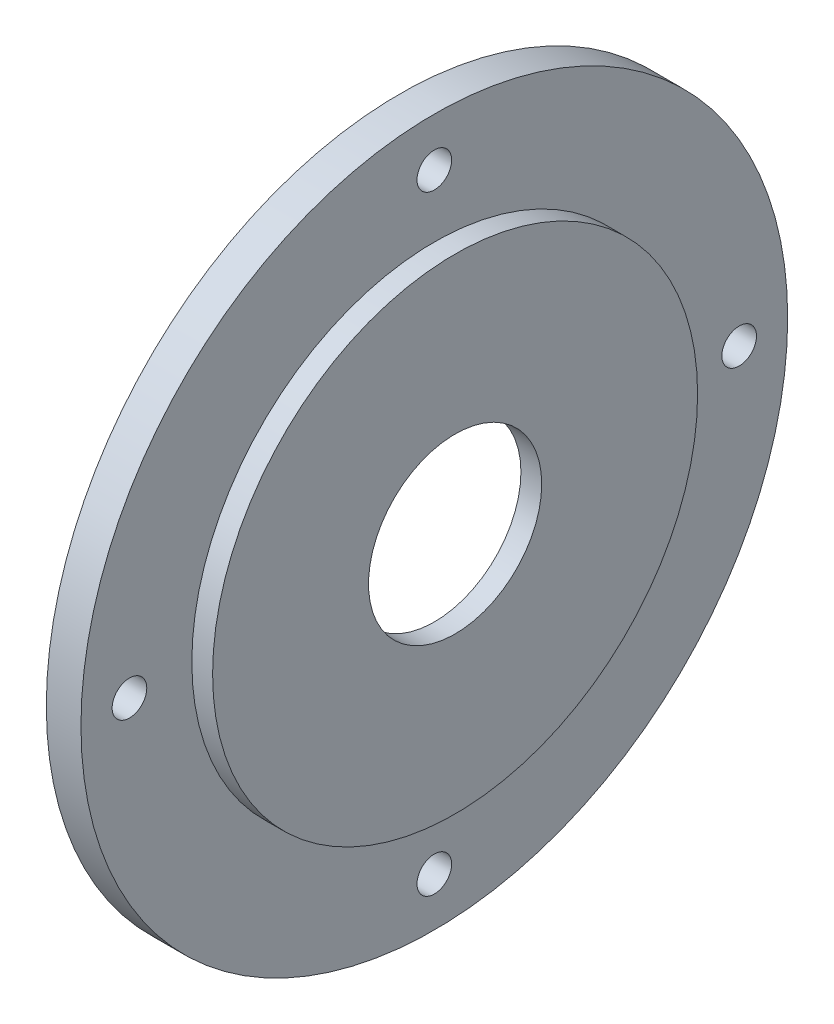
ISO-10303-21;
HEADER;
FILE_DESCRIPTION(('STEP AP214'),'2;1');
FILE_NAME('part.step','',(''),(''),'','','');
FILE_SCHEMA(('AUTOMOTIVE_DESIGN { 1 0 10303 214 1 1 1 1 }'));
ENDSEC;
DATA;
#1=APPLICATION_CONTEXT('core data for automotive mechanical design processes');
#2=APPLICATION_PROTOCOL_DEFINITION('international standard','automotive_design',2000,#1);
#3=PRODUCT_CONTEXT('',#1,'mechanical');
#4=PRODUCT('Part','Part','',(#3));
#5=PRODUCT_RELATED_PRODUCT_CATEGORY('part','',(#4));
#6=PRODUCT_DEFINITION_FORMATION('','',#4);
#7=PRODUCT_DEFINITION_CONTEXT('part definition',#1,'design');
#8=PRODUCT_DEFINITION('design','',#6,#7);
#9=PRODUCT_DEFINITION_SHAPE('','',#8);
#10=(LENGTH_UNIT() NAMED_UNIT(*) SI_UNIT(.MILLI.,.METRE.));
#11=(NAMED_UNIT(*) PLANE_ANGLE_UNIT() SI_UNIT($,.RADIAN.));
#12=(NAMED_UNIT(*) SI_UNIT($,.STERADIAN.) SOLID_ANGLE_UNIT());
#13=UNCERTAINTY_MEASURE_WITH_UNIT(LENGTH_MEASURE(1.E-05),#10,'distance_accuracy_value','');
#14=(GEOMETRIC_REPRESENTATION_CONTEXT(3) GLOBAL_UNCERTAINTY_ASSIGNED_CONTEXT((#13)) GLOBAL_UNIT_ASSIGNED_CONTEXT((#10,
#11,#12)) REPRESENTATION_CONTEXT('',''));
#15=CARTESIAN_POINT('',(0.,0.,0.));
#16=DIRECTION('',(0.,0.,1.));
#17=DIRECTION('',(1.,0.,0.));
#18=AXIS2_PLACEMENT_3D('',#15,#16,#17);
#19=CARTESIAN_POINT('',(5.,0.,0.));
#20=DIRECTION('',(1.,0.,0.));
#21=DIRECTION('',(0.,0.,-1.));
#22=AXIS2_PLACEMENT_3D('',#19,#20,#21);
#23=PLANE('',#22);
#24=CARTESIAN_POINT('',(5.,44.,0.));
#25=DIRECTION('',(1.,0.,0.));
#26=DIRECTION('',(0.,0.,-1.));
#27=AXIS2_PLACEMENT_3D('',#24,#25,#26);
#28=CIRCLE('',#27,2.5);
#29=CARTESIAN_POINT('',(5.,44.,-2.5));
#30=VERTEX_POINT('',#29);
#31=EDGE_CURVE('E90',#30,#30,#28,.T.);
#32=ORIENTED_EDGE('',*,*,#31,.F.);
#33=EDGE_LOOP('',(#32));
#34=FACE_BOUND('',#33,.T.);
#35=CARTESIAN_POINT('',(5.,1.2424725460634E-12,-44.0000000000012));
#36=DIRECTION('',(1.,0.,0.));
#37=DIRECTION('',(0.,0.,-1.));
#38=AXIS2_PLACEMENT_3D('',#35,#36,#37);
#39=CIRCLE('',#38,2.50000000000098);
#40=CARTESIAN_POINT('',(5.,1.2424725460634E-12,-46.5000000000022));
#41=VERTEX_POINT('',#40);
#42=EDGE_CURVE('E82',#41,#41,#39,.T.);
#43=ORIENTED_EDGE('',*,*,#42,.F.);
#44=EDGE_LOOP('',(#43));
#45=FACE_BOUND('',#44,.T.);
#46=CARTESIAN_POINT('',(5.,-44.,-2.48494509212681E-12));
#47=DIRECTION('',(1.,0.,0.));
#48=DIRECTION('',(0.,0.,-1.));
#49=AXIS2_PLACEMENT_3D('',#46,#47,#48);
#50=CIRCLE('',#49,2.50000000000267);
#51=CARTESIAN_POINT('',(5.,-44.,-2.50000000000516));
#52=VERTEX_POINT('',#51);
#53=EDGE_CURVE('E72',#52,#52,#50,.T.);
#54=ORIENTED_EDGE('',*,*,#53,.F.);
#55=EDGE_LOOP('',(#54));
#56=FACE_BOUND('',#55,.T.);
#57=CARTESIAN_POINT('',(5.,-1.24786099197965E-12,43.9999999999988));
#58=DIRECTION('',(1.,0.,0.));
#59=DIRECTION('',(0.,0.,-1.));
#60=AXIS2_PLACEMENT_3D('',#57,#58,#59);
#61=CIRCLE('',#60,2.500000000002);
#62=CARTESIAN_POINT('',(5.,-1.24786099197965E-12,41.4999999999968));
#63=VERTEX_POINT('',#62);
#64=EDGE_CURVE('E73',#63,#63,#61,.T.);
#65=ORIENTED_EDGE('',*,*,#64,.F.);
#66=EDGE_LOOP('',(#65));
#67=FACE_BOUND('',#66,.T.);
#68=CARTESIAN_POINT('',(5.,0.,0.));
#69=DIRECTION('',(1.,0.,0.));
#70=DIRECTION('',(0.,0.,-1.));
#71=AXIS2_PLACEMENT_3D('',#68,#69,#70);
#72=CIRCLE('',#71,35.);
#73=CARTESIAN_POINT('',(5.,0.,-35.));
#74=VERTEX_POINT('',#73);
#75=EDGE_CURVE('E60',#74,#74,#72,.T.);
#76=ORIENTED_EDGE('',*,*,#75,.F.);
#77=EDGE_LOOP('',(#76));
#78=FACE_BOUND('',#77,.T.);
#79=CARTESIAN_POINT('',(5.,0.,0.));
#80=DIRECTION('',(1.,0.,0.));
#81=DIRECTION('',(0.,0.,-1.));
#82=AXIS2_PLACEMENT_3D('',#79,#80,#81);
#83=CIRCLE('',#82,51.);
#84=CARTESIAN_POINT('',(5.,0.,-51.));
#85=VERTEX_POINT('',#84);
#86=EDGE_CURVE('E10',#85,#85,#83,.T.);
#87=ORIENTED_EDGE('',*,*,#86,.T.);
#88=EDGE_LOOP('',(#87));
#89=FACE_BOUND('',#88,.T.);
#90=ADVANCED_FACE('F37',(#34,#45,#56,#67,#78,#89),#23,.T.);
#91=CARTESIAN_POINT('',(0.,0.,0.));
#92=DIRECTION('',(1.,0.,0.));
#93=DIRECTION('',(0.,0.,-1.));
#94=AXIS2_PLACEMENT_3D('',#91,#92,#93);
#95=PLANE('',#94);
#96=CARTESIAN_POINT('',(0.,44.,0.));
#97=DIRECTION('',(1.,0.,0.));
#98=DIRECTION('',(0.,0.,-1.));
#99=AXIS2_PLACEMENT_3D('',#96,#97,#98);
#100=CIRCLE('',#99,2.5);
#101=CARTESIAN_POINT('',(0.,44.,-2.5));
#102=VERTEX_POINT('',#101);
#103=EDGE_CURVE('E64',#102,#102,#100,.F.);
#104=ORIENTED_EDGE('',*,*,#103,.F.);
#105=EDGE_LOOP('',(#104));
#106=FACE_BOUND('',#105,.T.);
#107=CARTESIAN_POINT('',(0.,1.2424725460634E-12,-44.0000000000012));
#108=DIRECTION('',(1.,0.,0.));
#109=DIRECTION('',(0.,0.,-1.));
#110=AXIS2_PLACEMENT_3D('',#107,#108,#109);
#111=CIRCLE('',#110,2.50000000000098);
#112=CARTESIAN_POINT('',(0.,1.2424725460634E-12,-46.5000000000022));
#113=VERTEX_POINT('',#112);
#114=EDGE_CURVE('E86',#113,#113,#111,.F.);
#115=ORIENTED_EDGE('',*,*,#114,.F.);
#116=EDGE_LOOP('',(#115));
#117=FACE_BOUND('',#116,.T.);
#118=CARTESIAN_POINT('',(0.,-44.,-2.48494509212681E-12));
#119=DIRECTION('',(1.,0.,0.));
#120=DIRECTION('',(0.,0.,-1.));
#121=AXIS2_PLACEMENT_3D('',#118,#119,#120);
#122=CIRCLE('',#121,2.50000000000267);
#123=CARTESIAN_POINT('',(0.,-44.,-2.50000000000516));
#124=VERTEX_POINT('',#123);
#125=EDGE_CURVE('E78',#124,#124,#122,.F.);
#126=ORIENTED_EDGE('',*,*,#125,.F.);
#127=EDGE_LOOP('',(#126));
#128=FACE_BOUND('',#127,.T.);
#129=CARTESIAN_POINT('',(0.,-1.24786099197965E-12,43.9999999999988));
#130=DIRECTION('',(1.,0.,0.));
#131=DIRECTION('',(0.,0.,-1.));
#132=AXIS2_PLACEMENT_3D('',#129,#130,#131);
#133=CIRCLE('',#132,2.500000000002);
#134=CARTESIAN_POINT('',(0.,-1.24786099197965E-12,41.4999999999968));
#135=VERTEX_POINT('',#134);
#136=EDGE_CURVE('E68',#135,#135,#133,.F.);
#137=ORIENTED_EDGE('',*,*,#136,.F.);
#138=EDGE_LOOP('',(#137));
#139=FACE_BOUND('',#138,.T.);
#140=CARTESIAN_POINT('',(0.,0.,0.));
#141=DIRECTION('',(1.,0.,0.));
#142=DIRECTION('',(0.,0.,-1.));
#143=AXIS2_PLACEMENT_3D('',#140,#141,#142);
#144=CIRCLE('',#143,51.);
#145=CARTESIAN_POINT('',(0.,0.,-51.));
#146=VERTEX_POINT('',#145);
#147=EDGE_CURVE('E41',#146,#146,#144,.T.);
#148=ORIENTED_EDGE('',*,*,#147,.F.);
#149=EDGE_LOOP('',(#148));
#150=FACE_BOUND('',#149,.T.);
#151=CARTESIAN_POINT('',(0.,0.,0.));
#152=DIRECTION('',(1.,0.,0.));
#153=DIRECTION('',(0.,0.,-1.));
#154=AXIS2_PLACEMENT_3D('',#151,#152,#153);
#155=CIRCLE('',#154,27.);
#156=CARTESIAN_POINT('',(0.,0.,-27.));
#157=VERTEX_POINT('',#156);
#158=EDGE_CURVE('E50',#157,#157,#155,.T.);
#159=ORIENTED_EDGE('',*,*,#158,.T.);
#160=EDGE_LOOP('',(#159));
#161=FACE_BOUND('',#160,.T.);
#162=ADVANCED_FACE('F126',(#106,#117,#128,#139,#150,#161),#95,.F.);
#163=CARTESIAN_POINT('',(5.,0.,0.));
#164=DIRECTION('',(-1.,0.,0.));
#165=DIRECTION('',(0.,0.,1.));
#166=AXIS2_PLACEMENT_3D('',#163,#164,#165);
#167=CYLINDRICAL_SURFACE('',#166,51.);
#168=ORIENTED_EDGE('',*,*,#86,.F.);
#169=EDGE_LOOP('',(#168));
#170=FACE_BOUND('',#169,.T.);
#171=ORIENTED_EDGE('',*,*,#147,.T.);
#172=EDGE_LOOP('',(#171));
#173=FACE_BOUND('',#172,.T.);
#174=ADVANCED_FACE('F39',(#170,#173),#167,.T.);
#175=CARTESIAN_POINT('',(5.,0.,0.));
#176=DIRECTION('',(-1.,0.,0.));
#177=DIRECTION('',(0.,0.,1.));
#178=AXIS2_PLACEMENT_3D('',#175,#176,#177);
#179=CYLINDRICAL_SURFACE('',#178,27.);
#180=CARTESIAN_POINT('',(5.,0.,0.));
#181=DIRECTION('',(1.,0.,0.));
#182=DIRECTION('',(0.,0.,-1.));
#183=AXIS2_PLACEMENT_3D('',#180,#181,#182);
#184=CIRCLE('',#183,27.);
#185=CARTESIAN_POINT('',(5.,0.,-27.));
#186=VERTEX_POINT('',#185);
#187=EDGE_CURVE('E55',#186,#186,#184,.T.);
#188=ORIENTED_EDGE('',*,*,#187,.T.);
#189=EDGE_LOOP('',(#188));
#190=FACE_BOUND('',#189,.T.);
#191=ORIENTED_EDGE('',*,*,#158,.F.);
#192=EDGE_LOOP('',(#191));
#193=FACE_BOUND('',#192,.T.);
#194=ADVANCED_FACE('F136',(#190,#193),#179,.F.);
#195=CARTESIAN_POINT('',(5.,0.,0.));
#196=DIRECTION('',(1.,0.,0.));
#197=DIRECTION('',(0.,0.,-1.));
#198=AXIS2_PLACEMENT_3D('',#195,#196,#197);
#199=PLANE('',#198);
#200=CARTESIAN_POINT('',(5.,0.,0.));
#201=DIRECTION('',(1.,0.,0.));
#202=DIRECTION('',(0.,0.,-1.));
#203=AXIS2_PLACEMENT_3D('',#200,#201,#202);
#204=CIRCLE('',#203,12.5);
#205=CARTESIAN_POINT('',(5.,0.,-12.5));
#206=VERTEX_POINT('',#205);
#207=EDGE_CURVE('E77',#206,#206,#204,.T.);
#208=ORIENTED_EDGE('',*,*,#207,.T.);
#209=EDGE_LOOP('',(#208));
#210=FACE_BOUND('',#209,.T.);
#211=ORIENTED_EDGE('',*,*,#187,.F.);
#212=EDGE_LOOP('',(#211));
#213=FACE_BOUND('',#212,.T.);
#214=ADVANCED_FACE('F121',(#210,#213),#199,.F.);
#215=CARTESIAN_POINT('',(8.,0.,0.));
#216=DIRECTION('',(-1.,0.,0.));
#217=DIRECTION('',(0.,0.,1.));
#218=AXIS2_PLACEMENT_3D('',#215,#216,#217);
#219=CYLINDRICAL_SURFACE('',#218,35.);
#220=CARTESIAN_POINT('',(8.,0.,0.));
#221=DIRECTION('',(1.,0.,0.));
#222=DIRECTION('',(0.,0.,-1.));
#223=AXIS2_PLACEMENT_3D('',#220,#221,#222);
#224=CIRCLE('',#223,35.);
#225=CARTESIAN_POINT('',(8.,0.,-35.));
#226=VERTEX_POINT('',#225);
#227=EDGE_CURVE('E59',#226,#226,#224,.T.);
#228=ORIENTED_EDGE('',*,*,#227,.F.);
#229=EDGE_LOOP('',(#228));
#230=FACE_BOUND('',#229,.T.);
#231=ORIENTED_EDGE('',*,*,#75,.T.);
#232=EDGE_LOOP('',(#231));
#233=FACE_BOUND('',#232,.T.);
#234=ADVANCED_FACE('F115',(#230,#233),#219,.T.);
#235=CARTESIAN_POINT('',(8.,0.,0.));
#236=DIRECTION('',(1.,0.,0.));
#237=DIRECTION('',(0.,0.,-1.));
#238=AXIS2_PLACEMENT_3D('',#235,#236,#237);
#239=PLANE('',#238);
#240=CARTESIAN_POINT('',(8.,0.,0.));
#241=DIRECTION('',(1.,0.,0.));
#242=DIRECTION('',(0.,0.,-1.));
#243=AXIS2_PLACEMENT_3D('',#240,#241,#242);
#244=CIRCLE('',#243,12.5);
#245=CARTESIAN_POINT('',(8.,0.,-12.5));
#246=VERTEX_POINT('',#245);
#247=EDGE_CURVE('E103',#246,#246,#244,.T.);
#248=ORIENTED_EDGE('',*,*,#247,.F.);
#249=EDGE_LOOP('',(#248));
#250=FACE_BOUND('',#249,.T.);
#251=ORIENTED_EDGE('',*,*,#227,.T.);
#252=EDGE_LOOP('',(#251));
#253=FACE_BOUND('',#252,.T.);
#254=ADVANCED_FACE('F111',(#250,#253),#239,.T.);
#255=CARTESIAN_POINT('',(-7.07106781187304,-1.24786099197965E-12,43.9999999999988));
#256=DIRECTION('',(1.,0.,0.));
#257=DIRECTION('',(0.,0.,-1.));
#258=AXIS2_PLACEMENT_3D('',#255,#256,#257);
#259=CYLINDRICAL_SURFACE('',#258,2.500000000002);
#260=ORIENTED_EDGE('',*,*,#136,.T.);
#261=EDGE_LOOP('',(#260));
#262=FACE_BOUND('',#261,.T.);
#263=ORIENTED_EDGE('',*,*,#64,.T.);
#264=EDGE_LOOP('',(#263));
#265=FACE_BOUND('',#264,.T.);
#266=ADVANCED_FACE('F114',(#262,#265),#259,.F.);
#267=CARTESIAN_POINT('',(-7.07106781187304,-44.,-2.48494509212681E-12));
#268=DIRECTION('',(1.,0.,0.));
#269=DIRECTION('',(0.,0.,-1.));
#270=AXIS2_PLACEMENT_3D('',#267,#268,#269);
#271=CYLINDRICAL_SURFACE('',#270,2.50000000000267);
#272=ORIENTED_EDGE('',*,*,#125,.T.);
#273=EDGE_LOOP('',(#272));
#274=FACE_BOUND('',#273,.T.);
#275=ORIENTED_EDGE('',*,*,#53,.T.);
#276=EDGE_LOOP('',(#275));
#277=FACE_BOUND('',#276,.T.);
#278=ADVANCED_FACE('F145',(#274,#277),#271,.F.);
#279=CARTESIAN_POINT('',(-7.07106781187304,1.2424725460634E-12,-44.0000000000012));
#280=DIRECTION('',(1.,0.,0.));
#281=DIRECTION('',(0.,0.,-1.));
#282=AXIS2_PLACEMENT_3D('',#279,#280,#281);
#283=CYLINDRICAL_SURFACE('',#282,2.50000000000098);
#284=ORIENTED_EDGE('',*,*,#114,.T.);
#285=EDGE_LOOP('',(#284));
#286=FACE_BOUND('',#285,.T.);
#287=ORIENTED_EDGE('',*,*,#42,.T.);
#288=EDGE_LOOP('',(#287));
#289=FACE_BOUND('',#288,.T.);
#290=ADVANCED_FACE('F149',(#286,#289),#283,.F.);
#291=CARTESIAN_POINT('',(-7.07106781187304,44.,0.));
#292=DIRECTION('',(1.,0.,0.));
#293=DIRECTION('',(0.,0.,-1.));
#294=AXIS2_PLACEMENT_3D('',#291,#292,#293);
#295=CYLINDRICAL_SURFACE('',#294,2.5);
#296=ORIENTED_EDGE('',*,*,#103,.T.);
#297=EDGE_LOOP('',(#296));
#298=FACE_BOUND('',#297,.T.);
#299=ORIENTED_EDGE('',*,*,#31,.T.);
#300=EDGE_LOOP('',(#299));
#301=FACE_BOUND('',#300,.T.);
#302=ADVANCED_FACE('F153',(#298,#301),#295,.F.);
#303=CARTESIAN_POINT('',(-35.3553390593274,0.,0.));
#304=DIRECTION('',(1.,0.,0.));
#305=DIRECTION('',(0.,0.,-1.));
#306=AXIS2_PLACEMENT_3D('',#303,#304,#305);
#307=CYLINDRICAL_SURFACE('',#306,12.5);
#308=ORIENTED_EDGE('',*,*,#247,.T.);
#309=EDGE_LOOP('',(#308));
#310=FACE_BOUND('',#309,.T.);
#311=ORIENTED_EDGE('',*,*,#207,.F.);
#312=EDGE_LOOP('',(#311));
#313=FACE_BOUND('',#312,.T.);
#314=ADVANCED_FACE('F108',(#310,#313),#307,.F.);
#315=CLOSED_SHELL('',(#90,#162,#174,#194,#214,#234,#254,#266,#278,#290,#302,#314));
#316=MANIFOLD_SOLID_BREP('B2',#315);
#317=ADVANCED_BREP_SHAPE_REPRESENTATION('',(#18,#316),#14);
#318=SHAPE_DEFINITION_REPRESENTATION(#9,#317);
ENDSEC;
END-ISO-10303-21;
